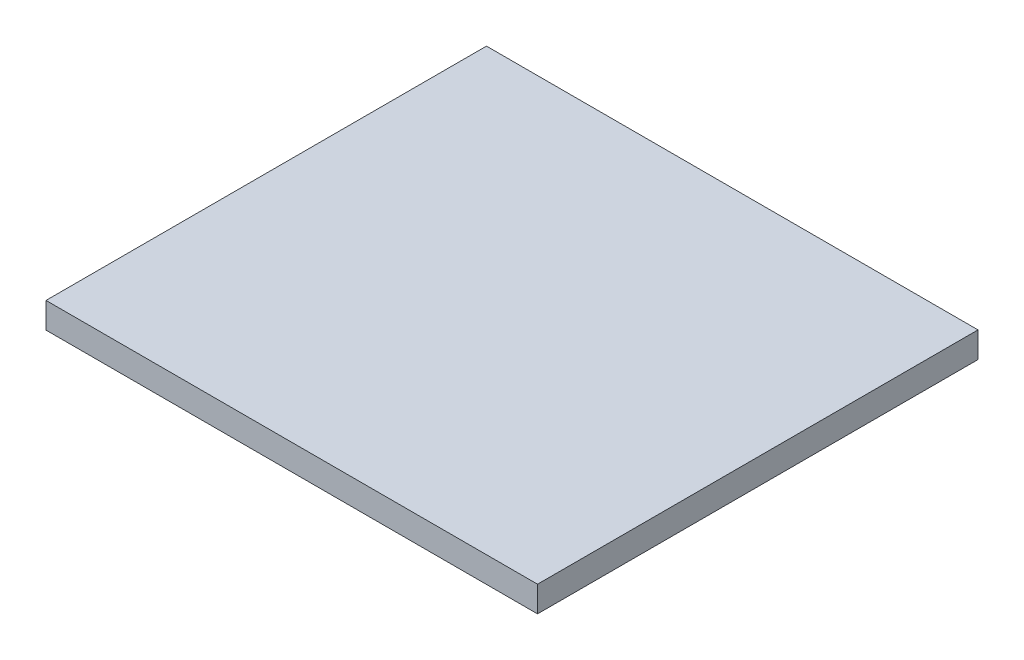
ISO-10303-21;
HEADER;
FILE_DESCRIPTION(('STEP AP214'),'2;1');
FILE_NAME('part.step','',(''),(''),'','','');
FILE_SCHEMA(('AUTOMOTIVE_DESIGN { 1 0 10303 214 1 1 1 1 }'));
ENDSEC;
DATA;
#1=APPLICATION_CONTEXT('core data for automotive mechanical design processes');
#2=APPLICATION_PROTOCOL_DEFINITION('international standard','automotive_design',2000,#1);
#3=PRODUCT_CONTEXT('',#1,'mechanical');
#4=PRODUCT('Part','Part','',(#3));
#5=PRODUCT_RELATED_PRODUCT_CATEGORY('part','',(#4));
#6=PRODUCT_DEFINITION_FORMATION('','',#4);
#7=PRODUCT_DEFINITION_CONTEXT('part definition',#1,'design');
#8=PRODUCT_DEFINITION('design','',#6,#7);
#9=PRODUCT_DEFINITION_SHAPE('','',#8);
#10=(LENGTH_UNIT() NAMED_UNIT(*) SI_UNIT(.MILLI.,.METRE.));
#11=(NAMED_UNIT(*) PLANE_ANGLE_UNIT() SI_UNIT($,.RADIAN.));
#12=(NAMED_UNIT(*) SI_UNIT($,.STERADIAN.) SOLID_ANGLE_UNIT());
#13=UNCERTAINTY_MEASURE_WITH_UNIT(LENGTH_MEASURE(1.E-05),#10,'distance_accuracy_value','');
#14=(GEOMETRIC_REPRESENTATION_CONTEXT(3) GLOBAL_UNCERTAINTY_ASSIGNED_CONTEXT((#13)) GLOBAL_UNIT_ASSIGNED_CONTEXT((#10,
#11,#12)) REPRESENTATION_CONTEXT('',''));
#15=CARTESIAN_POINT('',(0.,0.,0.));
#16=DIRECTION('',(0.,0.,1.));
#17=DIRECTION('',(1.,0.,0.));
#18=AXIS2_PLACEMENT_3D('',#15,#16,#17);
#19=CARTESIAN_POINT('',(-91.8447741290215,10.,-80.024514736677));
#20=DIRECTION('',(1.,0.,0.));
#21=DIRECTION('',(0.,0.,-1.));
#22=AXIS2_PLACEMENT_3D('',#19,#20,#21);
#23=PLANE('',#22);
#24=DIRECTION('',(0.,0.,1.));
#25=VECTOR('',#24,1.);
#26=CARTESIAN_POINT('',(-91.8447741290215,0.,-80.024514736677));
#27=LINE('',#26,#25);
#28=CARTESIAN_POINT('',(-91.8447741290215,0.,-80.024514736677));
#29=VERTEX_POINT('',#28);
#30=CARTESIAN_POINT('',(-91.8447741290215,0.,91.1654488765879));
#31=VERTEX_POINT('',#30);
#32=EDGE_CURVE('E100',#29,#31,#27,.T.);
#33=ORIENTED_EDGE('',*,*,#32,.T.);
#34=DIRECTION('',(0.,-1.,0.));
#35=VECTOR('',#34,1.);
#36=CARTESIAN_POINT('',(-91.8447741290215,10.,91.1654488765879));
#37=LINE('',#36,#35);
#38=CARTESIAN_POINT('',(-91.8447741290215,10.,91.1654488765879));
#39=VERTEX_POINT('',#38);
#40=EDGE_CURVE('E11',#39,#31,#37,.T.);
#41=ORIENTED_EDGE('',*,*,#40,.F.);
#42=DIRECTION('',(0.,0.,1.));
#43=VECTOR('',#42,1.);
#44=CARTESIAN_POINT('',(-91.8447741290215,10.,-80.024514736677));
#45=LINE('',#44,#43);
#46=CARTESIAN_POINT('',(-91.8447741290215,10.,-80.024514736677));
#47=VERTEX_POINT('',#46);
#48=EDGE_CURVE('E88',#47,#39,#45,.T.);
#49=ORIENTED_EDGE('',*,*,#48,.F.);
#50=DIRECTION('',(0.,-1.,0.));
#51=VECTOR('',#50,1.);
#52=CARTESIAN_POINT('',(-91.8447741290215,10.,-80.024514736677));
#53=LINE('',#52,#51);
#54=EDGE_CURVE('E96',#47,#29,#53,.T.);
#55=ORIENTED_EDGE('',*,*,#54,.T.);
#56=EDGE_LOOP('',(#33,#41,#49,#55));
#57=FACE_BOUND('',#56,.T.);
#58=ADVANCED_FACE('F37',(#57),#23,.F.);
#59=CARTESIAN_POINT('',(-91.8447741290215,10.,91.1654488765879));
#60=DIRECTION('',(0.,0.,-1.));
#61=DIRECTION('',(-1.,0.,0.));
#62=AXIS2_PLACEMENT_3D('',#59,#60,#61);
#63=PLANE('',#62);
#64=DIRECTION('',(1.,0.,0.));
#65=VECTOR('',#64,1.);
#66=CARTESIAN_POINT('',(-91.8447741290215,0.,91.1654488765879));
#67=LINE('',#66,#65);
#68=CARTESIAN_POINT('',(99.1814868553043,0.,91.1654488765879));
#69=VERTEX_POINT('',#68);
#70=EDGE_CURVE('E92',#31,#69,#67,.T.);
#71=ORIENTED_EDGE('',*,*,#70,.T.);
#72=DIRECTION('',(0.,-1.,0.));
#73=VECTOR('',#72,1.);
#74=CARTESIAN_POINT('',(99.1814868553043,10.,91.1654488765879));
#75=LINE('',#74,#73);
#76=CARTESIAN_POINT('',(99.1814868553043,10.,91.1654488765879));
#77=VERTEX_POINT('',#76);
#78=EDGE_CURVE('E45',#77,#69,#75,.T.);
#79=ORIENTED_EDGE('',*,*,#78,.F.);
#80=DIRECTION('',(1.,0.,0.));
#81=VECTOR('',#80,1.);
#82=CARTESIAN_POINT('',(-91.8447741290215,10.,91.1654488765879));
#83=LINE('',#82,#81);
#84=EDGE_CURVE('E83',#39,#77,#83,.T.);
#85=ORIENTED_EDGE('',*,*,#84,.F.);
#86=ORIENTED_EDGE('',*,*,#40,.T.);
#87=EDGE_LOOP('',(#71,#79,#85,#86));
#88=FACE_BOUND('',#87,.T.);
#89=ADVANCED_FACE('F91',(#88),#63,.F.);
#90=CARTESIAN_POINT('',(99.1814868553043,10.,-80.024514736677));
#91=DIRECTION('',(-1.,0.,0.));
#92=DIRECTION('',(0.,0.,1.));
#93=AXIS2_PLACEMENT_3D('',#90,#91,#92);
#94=PLANE('',#93);
#95=DIRECTION('',(0.,0.,-1.));
#96=VECTOR('',#95,1.);
#97=CARTESIAN_POINT('',(99.1814868553043,0.,-80.024514736677));
#98=LINE('',#97,#96);
#99=CARTESIAN_POINT('',(99.1814868553043,0.,-80.024514736677));
#100=VERTEX_POINT('',#99);
#101=EDGE_CURVE('E70',#69,#100,#98,.T.);
#102=ORIENTED_EDGE('',*,*,#101,.T.);
#103=DIRECTION('',(0.,-1.,0.));
#104=VECTOR('',#103,1.);
#105=CARTESIAN_POINT('',(99.1814868553043,10.,-80.024514736677));
#106=LINE('',#105,#104);
#107=CARTESIAN_POINT('',(99.1814868553043,10.,-80.024514736677));
#108=VERTEX_POINT('',#107);
#109=EDGE_CURVE('E93',#108,#100,#106,.T.);
#110=ORIENTED_EDGE('',*,*,#109,.F.);
#111=DIRECTION('',(0.,0.,-1.));
#112=VECTOR('',#111,1.);
#113=CARTESIAN_POINT('',(99.1814868553043,10.,-80.024514736677));
#114=LINE('',#113,#112);
#115=EDGE_CURVE('E86',#77,#108,#114,.T.);
#116=ORIENTED_EDGE('',*,*,#115,.F.);
#117=ORIENTED_EDGE('',*,*,#78,.T.);
#118=EDGE_LOOP('',(#102,#110,#116,#117));
#119=FACE_BOUND('',#118,.T.);
#120=ADVANCED_FACE('F94',(#119),#94,.F.);
#121=CARTESIAN_POINT('',(-91.8447741290215,10.,-80.024514736677));
#122=DIRECTION('',(0.,0.,1.));
#123=DIRECTION('',(1.,0.,0.));
#124=AXIS2_PLACEMENT_3D('',#121,#122,#123);
#125=PLANE('',#124);
#126=DIRECTION('',(-1.,0.,0.));
#127=VECTOR('',#126,1.);
#128=CARTESIAN_POINT('',(-91.8447741290215,0.,-80.024514736677));
#129=LINE('',#128,#127);
#130=EDGE_CURVE('E76',#100,#29,#129,.T.);
#131=ORIENTED_EDGE('',*,*,#130,.T.);
#132=ORIENTED_EDGE('',*,*,#54,.F.);
#133=DIRECTION('',(-1.,0.,0.));
#134=VECTOR('',#133,1.);
#135=CARTESIAN_POINT('',(-91.8447741290215,10.,-80.024514736677));
#136=LINE('',#135,#134);
#137=EDGE_CURVE('E53',#108,#47,#136,.T.);
#138=ORIENTED_EDGE('',*,*,#137,.F.);
#139=ORIENTED_EDGE('',*,*,#109,.T.);
#140=EDGE_LOOP('',(#131,#132,#138,#139));
#141=FACE_BOUND('',#140,.T.);
#142=ADVANCED_FACE('F107',(#141),#125,.F.);
#143=CARTESIAN_POINT('',(-91.8447741290215,10.,91.1654488765879));
#144=DIRECTION('',(0.,1.,0.));
#145=DIRECTION('',(0.,0.,1.));
#146=AXIS2_PLACEMENT_3D('',#143,#144,#145);
#147=PLANE('',#146);
#148=ORIENTED_EDGE('',*,*,#48,.T.);
#149=ORIENTED_EDGE('',*,*,#84,.T.);
#150=ORIENTED_EDGE('',*,*,#115,.T.);
#151=ORIENTED_EDGE('',*,*,#137,.T.);
#152=EDGE_LOOP('',(#148,#149,#150,#151));
#153=FACE_BOUND('',#152,.T.);
#154=ADVANCED_FACE('F84',(#153),#147,.T.);
#155=CARTESIAN_POINT('',(-91.8447741290215,0.,91.1654488765879));
#156=DIRECTION('',(0.,1.,0.));
#157=DIRECTION('',(0.,0.,1.));
#158=AXIS2_PLACEMENT_3D('',#155,#156,#157);
#159=PLANE('',#158);
#160=ORIENTED_EDGE('',*,*,#32,.F.);
#161=ORIENTED_EDGE('',*,*,#130,.F.);
#162=ORIENTED_EDGE('',*,*,#101,.F.);
#163=ORIENTED_EDGE('',*,*,#70,.F.);
#164=EDGE_LOOP('',(#160,#161,#162,#163));
#165=FACE_BOUND('',#164,.T.);
#166=ADVANCED_FACE('F110',(#165),#159,.F.);
#167=CLOSED_SHELL('',(#58,#89,#120,#142,#154,#166));
#168=MANIFOLD_SOLID_BREP('B2',#167);
#169=ADVANCED_BREP_SHAPE_REPRESENTATION('',(#18,#168),#14);
#170=SHAPE_DEFINITION_REPRESENTATION(#9,#169);
ENDSEC;
END-ISO-10303-21;
